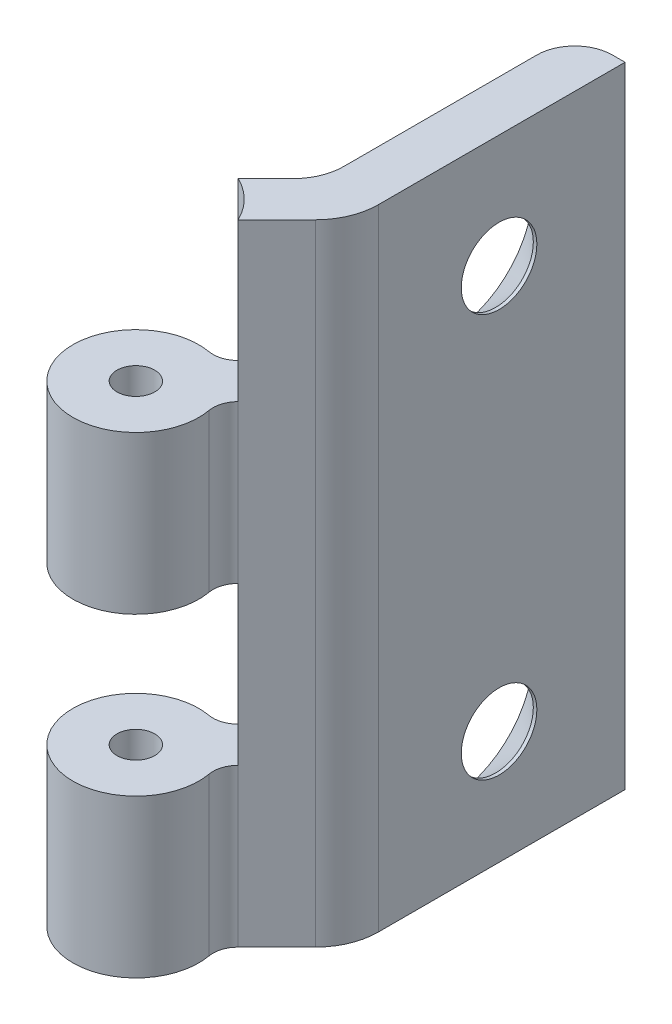
ISO-10303-21;
HEADER;
FILE_DESCRIPTION(('STEP AP214'),'2;1');
FILE_NAME('part.step','',(''),(''),'','','');
FILE_SCHEMA(('AUTOMOTIVE_DESIGN { 1 0 10303 214 1 1 1 1 }'));
ENDSEC;
DATA;
#1=APPLICATION_CONTEXT('core data for automotive mechanical design processes');
#2=APPLICATION_PROTOCOL_DEFINITION('international standard','automotive_design',2000,#1);
#3=PRODUCT_CONTEXT('',#1,'mechanical');
#4=PRODUCT('Part','Part','',(#3));
#5=PRODUCT_RELATED_PRODUCT_CATEGORY('part','',(#4));
#6=PRODUCT_DEFINITION_FORMATION('','',#4);
#7=PRODUCT_DEFINITION_CONTEXT('part definition',#1,'design');
#8=PRODUCT_DEFINITION('design','',#6,#7);
#9=PRODUCT_DEFINITION_SHAPE('','',#8);
#10=(LENGTH_UNIT() NAMED_UNIT(*) SI_UNIT(.MILLI.,.METRE.));
#11=(NAMED_UNIT(*) PLANE_ANGLE_UNIT() SI_UNIT($,.RADIAN.));
#12=(NAMED_UNIT(*) SI_UNIT($,.STERADIAN.) SOLID_ANGLE_UNIT());
#13=UNCERTAINTY_MEASURE_WITH_UNIT(LENGTH_MEASURE(1.E-05),#10,'distance_accuracy_value','');
#14=(GEOMETRIC_REPRESENTATION_CONTEXT(3) GLOBAL_UNCERTAINTY_ASSIGNED_CONTEXT((#13)) GLOBAL_UNIT_ASSIGNED_CONTEXT((#10,
#11,#12)) REPRESENTATION_CONTEXT('',''));
#15=CARTESIAN_POINT('',(0.,0.,0.));
#16=DIRECTION('',(0.,0.,1.));
#17=DIRECTION('',(1.,0.,0.));
#18=AXIS2_PLACEMENT_3D('',#15,#16,#17);
#19=CARTESIAN_POINT('',(0.,0.1,0.));
#20=DIRECTION('',(0.,1.,0.));
#21=DIRECTION('',(0.,0.,1.));
#22=AXIS2_PLACEMENT_3D('',#19,#20,#21);
#23=CYLINDRICAL_SURFACE('',#22,0.75);
#24=CARTESIAN_POINT('',(0.,18.75,0.));
#25=DIRECTION('',(0.,1.,0.));
#26=DIRECTION('',(0.,0.,1.));
#27=AXIS2_PLACEMENT_3D('',#24,#25,#26);
#28=CIRCLE('',#27,0.75);
#29=CARTESIAN_POINT('',(0.,18.75,0.75));
#30=VERTEX_POINT('',#29);
#31=EDGE_CURVE('E178',#30,#30,#28,.F.);
#32=ORIENTED_EDGE('',*,*,#31,.F.);
#33=EDGE_LOOP('',(#32));
#34=FACE_BOUND('',#33,.T.);
#35=CARTESIAN_POINT('',(0.,12.5,0.));
#36=DIRECTION('',(0.,1.,0.));
#37=DIRECTION('',(0.,0.,1.));
#38=AXIS2_PLACEMENT_3D('',#35,#36,#37);
#39=CIRCLE('',#38,0.75);
#40=CARTESIAN_POINT('',(0.,12.5,0.75));
#41=VERTEX_POINT('',#40);
#42=EDGE_CURVE('E189',#41,#41,#39,.F.);
#43=ORIENTED_EDGE('',*,*,#42,.T.);
#44=EDGE_LOOP('',(#43));
#45=FACE_BOUND('',#44,.T.);
#46=ADVANCED_FACE('F16',(#34,#45),#23,.F.);
#47=CARTESIAN_POINT('',(0.616796038786,3.125,-3.44522316353));
#48=DIRECTION('',(0.,1.,0.));
#49=DIRECTION('',(0.,0.,1.));
#50=AXIS2_PLACEMENT_3D('',#47,#48,#49);
#51=CYLINDRICAL_SURFACE('',#50,1.);
#52=CARTESIAN_POINT('',(0.616796038786,12.5,-3.44522316353));
#53=DIRECTION('',(0.,1.,0.));
#54=DIRECTION('',(0.,0.,1.));
#55=AXIS2_PLACEMENT_3D('',#52,#53,#54);
#56=CIRCLE('',#55,1.);
#57=CARTESIAN_POINT('',(1.32390281997229,12.5,-2.73811638234775));
#58=VERTEX_POINT('',#57);
#59=CARTESIAN_POINT('',(0.440568599132631,12.5,-2.4608736882362));
#60=VERTEX_POINT('',#59);
#61=EDGE_CURVE('E19',#58,#60,#56,.F.);
#62=ORIENTED_EDGE('',*,*,#61,.T.);
#63=DIRECTION('',(0.,1.,0.));
#64=VECTOR('',#63,1.);
#65=CARTESIAN_POINT('',(0.440568599132508,3.125,-2.46087368823725));
#66=LINE('',#65,#64);
#67=CARTESIAN_POINT('',(0.440568599132811,18.75,-2.4608736882372));
#68=VERTEX_POINT('',#67);
#69=EDGE_CURVE('E148',#68,#60,#66,.F.);
#70=ORIENTED_EDGE('',*,*,#69,.F.);
#71=CARTESIAN_POINT('',(0.616796038786,18.75,-3.44522316353));
#72=DIRECTION('',(0.,1.,0.));
#73=DIRECTION('',(0.,0.,1.));
#74=AXIS2_PLACEMENT_3D('',#71,#72,#73);
#75=CIRCLE('',#74,1.);
#76=CARTESIAN_POINT('',(1.32390281997229,18.75,-2.73811638234775));
#77=VERTEX_POINT('',#76);
#78=EDGE_CURVE('E131',#77,#68,#75,.F.);
#79=ORIENTED_EDGE('',*,*,#78,.F.);
#80=DIRECTION('',(0.,1.,0.));
#81=VECTOR('',#80,1.);
#82=CARTESIAN_POINT('',(1.32390281997,0.,-2.73811638235));
#83=LINE('',#82,#81);
#84=EDGE_CURVE('E126',#77,#58,#83,.F.);
#85=ORIENTED_EDGE('',*,*,#84,.T.);
#86=EDGE_LOOP('',(#62,#70,#79,#85));
#87=FACE_BOUND('',#86,.T.);
#88=ADVANCED_FACE('F128',(#87),#51,.F.);
#89=CARTESIAN_POINT('',(0.,3.125,0.));
#90=DIRECTION('',(0.,1.,0.));
#91=DIRECTION('',(0.,0.,1.));
#92=AXIS2_PLACEMENT_3D('',#89,#90,#91);
#93=CYLINDRICAL_SURFACE('',#92,2.5);
#94=DIRECTION('',(0.,1.,0.));
#95=VECTOR('',#94,1.);
#96=CARTESIAN_POINT('',(2.46087368823525,3.125,-0.44056859913215));
#97=LINE('',#96,#95);
#98=CARTESIAN_POINT('',(2.4608736882362,12.5,-0.440568599132631));
#99=VERTEX_POINT('',#98);
#100=CARTESIAN_POINT('',(2.4608736882362,18.75,-0.440568599132631));
#101=VERTEX_POINT('',#100);
#102=EDGE_CURVE('E165',#99,#101,#97,.T.);
#103=ORIENTED_EDGE('',*,*,#102,.T.);
#104=CARTESIAN_POINT('',(0.,18.75,0.));
#105=DIRECTION('',(0.,1.,0.));
#106=DIRECTION('',(0.,0.,1.));
#107=AXIS2_PLACEMENT_3D('',#104,#105,#106);
#108=CIRCLE('',#107,2.5);
#109=EDGE_CURVE('E181',#68,#101,#108,.T.);
#110=ORIENTED_EDGE('',*,*,#109,.F.);
#111=ORIENTED_EDGE('',*,*,#69,.T.);
#112=CARTESIAN_POINT('',(0.,12.5,0.));
#113=DIRECTION('',(0.,1.,0.));
#114=DIRECTION('',(0.,0.,1.));
#115=AXIS2_PLACEMENT_3D('',#112,#113,#114);
#116=CIRCLE('',#115,2.5);
#117=EDGE_CURVE('E147',#60,#99,#116,.T.);
#118=ORIENTED_EDGE('',*,*,#117,.T.);
#119=EDGE_LOOP('',(#103,#110,#111,#118));
#120=FACE_BOUND('',#119,.T.);
#121=ADVANCED_FACE('F192',(#120),#93,.T.);
#122=CARTESIAN_POINT('',(0.,12.5,0.));
#123=DIRECTION('',(0.,1.,0.));
#124=DIRECTION('',(0.,0.,1.));
#125=AXIS2_PLACEMENT_3D('',#122,#123,#124);
#126=PLANE('',#125);
#127=ORIENTED_EDGE('',*,*,#42,.F.);
#128=EDGE_LOOP('',(#127));
#129=FACE_BOUND('',#128,.T.);
#130=CARTESIAN_POINT('',(3.44522316353,12.5,-0.616796038786));
#131=DIRECTION('',(0.,1.,0.));
#132=DIRECTION('',(0.,0.,1.));
#133=AXIS2_PLACEMENT_3D('',#130,#131,#132);
#134=CIRCLE('',#133,1.);
#135=CARTESIAN_POINT('',(2.73811638234775,12.5,-1.32390281997229));
#136=VERTEX_POINT('',#135);
#137=EDGE_CURVE('E170',#136,#99,#134,.T.);
#138=ORIENTED_EDGE('',*,*,#137,.T.);
#139=ORIENTED_EDGE('',*,*,#117,.F.);
#140=ORIENTED_EDGE('',*,*,#61,.F.);
#141=CARTESIAN_POINT('',(0.,12.5,0.));
#142=DIRECTION('',(0.,1.,0.));
#143=DIRECTION('',(0.,0.,1.));
#144=AXIS2_PLACEMENT_3D('',#141,#142,#143);
#145=CIRCLE('',#144,3.04138126515);
#146=EDGE_CURVE('E145',#58,#136,#145,.F.);
#147=ORIENTED_EDGE('',*,*,#146,.T.);
#148=EDGE_LOOP('',(#138,#139,#140,#147));
#149=FACE_BOUND('',#148,.T.);
#150=ADVANCED_FACE('F143',(#129,#149),#126,.F.);
#151=CARTESIAN_POINT('',(0.616796038786,3.125,-3.44522316353));
#152=DIRECTION('',(0.,1.,0.));
#153=DIRECTION('',(0.,0.,1.));
#154=AXIS2_PLACEMENT_3D('',#151,#152,#153);
#155=CYLINDRICAL_SURFACE('',#154,1.);
#156=CARTESIAN_POINT('',(0.616796038786,0.,-3.44522316353));
#157=DIRECTION('',(0.,1.,0.));
#158=DIRECTION('',(0.,0.,1.));
#159=AXIS2_PLACEMENT_3D('',#156,#157,#158);
#160=CIRCLE('',#159,1.);
#161=CARTESIAN_POINT('',(0.440568599132631,0.,-2.4608736882362));
#162=VERTEX_POINT('',#161);
#163=CARTESIAN_POINT('',(1.323902819969,0.,-2.738116382349));
#164=VERTEX_POINT('',#163);
#165=EDGE_CURVE('E187',#162,#164,#160,.T.);
#166=ORIENTED_EDGE('',*,*,#165,.F.);
#167=DIRECTION('',(0.,1.,0.));
#168=VECTOR('',#167,1.);
#169=CARTESIAN_POINT('',(0.440568599132508,3.125,-2.46087368823725));
#170=LINE('',#169,#168);
#171=CARTESIAN_POINT('',(0.440568599132631,6.25,-2.4608736882362));
#172=VERTEX_POINT('',#171);
#173=EDGE_CURVE('E226',#172,#162,#170,.F.);
#174=ORIENTED_EDGE('',*,*,#173,.F.);
#175=CARTESIAN_POINT('',(0.616796038786,6.25,-3.44522316353));
#176=DIRECTION('',(0.,1.,0.));
#177=DIRECTION('',(0.,0.,1.));
#178=AXIS2_PLACEMENT_3D('',#175,#176,#177);
#179=CIRCLE('',#178,1.);
#180=CARTESIAN_POINT('',(1.32390281997229,6.25,-2.73811638234775));
#181=VERTEX_POINT('',#180);
#182=EDGE_CURVE('E184',#181,#172,#179,.F.);
#183=ORIENTED_EDGE('',*,*,#182,.F.);
#184=DIRECTION('',(0.,1.,0.));
#185=VECTOR('',#184,1.);
#186=CARTESIAN_POINT('',(1.32390281997,0.,-2.73811638235));
#187=LINE('',#186,#185);
#188=EDGE_CURVE('E137',#181,#164,#187,.F.);
#189=ORIENTED_EDGE('',*,*,#188,.T.);
#190=EDGE_LOOP('',(#166,#174,#183,#189));
#191=FACE_BOUND('',#190,.T.);
#192=ADVANCED_FACE('F545',(#191),#155,.F.);
#193=CARTESIAN_POINT('',(0.,6.25,0.));
#194=DIRECTION('',(0.,1.,0.));
#195=DIRECTION('',(0.,0.,1.));
#196=AXIS2_PLACEMENT_3D('',#193,#194,#195);
#197=PLANE('',#196);
#198=CARTESIAN_POINT('',(0.,6.25,0.));
#199=DIRECTION('',(0.,1.,0.));
#200=DIRECTION('',(0.,0.,1.));
#201=AXIS2_PLACEMENT_3D('',#198,#199,#200);
#202=CIRCLE('',#201,0.75);
#203=CARTESIAN_POINT('',(0.,6.25,0.75));
#204=VERTEX_POINT('',#203);
#205=EDGE_CURVE('E211',#204,#204,#202,.F.);
#206=ORIENTED_EDGE('',*,*,#205,.T.);
#207=EDGE_LOOP('',(#206));
#208=FACE_BOUND('',#207,.T.);
#209=CARTESIAN_POINT('',(3.44522316353,6.25,-0.616796038786));
#210=DIRECTION('',(0.,1.,0.));
#211=DIRECTION('',(0.,0.,1.));
#212=AXIS2_PLACEMENT_3D('',#209,#210,#211);
#213=CIRCLE('',#212,1.);
#214=CARTESIAN_POINT('',(2.4608736882362,6.25,-0.440568599132631));
#215=VERTEX_POINT('',#214);
#216=CARTESIAN_POINT('',(2.73811638234775,6.25,-1.32390281997229));
#217=VERTEX_POINT('',#216);
#218=EDGE_CURVE('E157',#215,#217,#213,.F.);
#219=ORIENTED_EDGE('',*,*,#218,.T.);
#220=CARTESIAN_POINT('',(0.,6.25,0.));
#221=DIRECTION('',(0.,1.,0.));
#222=DIRECTION('',(0.,0.,1.));
#223=AXIS2_PLACEMENT_3D('',#220,#221,#222);
#224=CIRCLE('',#223,3.04138126515);
#225=EDGE_CURVE('E158',#217,#181,#224,.T.);
#226=ORIENTED_EDGE('',*,*,#225,.T.);
#227=ORIENTED_EDGE('',*,*,#182,.T.);
#228=CARTESIAN_POINT('',(0.,6.25,0.));
#229=DIRECTION('',(0.,1.,0.));
#230=DIRECTION('',(0.,0.,1.));
#231=AXIS2_PLACEMENT_3D('',#228,#229,#230);
#232=CIRCLE('',#231,2.5);
#233=EDGE_CURVE('E215',#215,#172,#232,.F.);
#234=ORIENTED_EDGE('',*,*,#233,.F.);
#235=EDGE_LOOP('',(#219,#226,#227,#234));
#236=FACE_BOUND('',#235,.T.);
#237=ADVANCED_FACE('F233',(#208,#236),#197,.T.);
#238=CARTESIAN_POINT('',(0.,18.75,0.));
#239=DIRECTION('',(0.,1.,0.));
#240=DIRECTION('',(0.,0.,1.));
#241=AXIS2_PLACEMENT_3D('',#238,#239,#240);
#242=PLANE('',#241);
#243=ORIENTED_EDGE('',*,*,#31,.T.);
#244=EDGE_LOOP('',(#243));
#245=FACE_BOUND('',#244,.T.);
#246=CARTESIAN_POINT('',(3.44522316353,18.75,-0.616796038786));
#247=DIRECTION('',(0.,1.,0.));
#248=DIRECTION('',(0.,0.,1.));
#249=AXIS2_PLACEMENT_3D('',#246,#247,#248);
#250=CIRCLE('',#249,1.);
#251=CARTESIAN_POINT('',(2.73811638234775,18.75,-1.32390281997229));
#252=VERTEX_POINT('',#251);
#253=EDGE_CURVE('E175',#101,#252,#250,.F.);
#254=ORIENTED_EDGE('',*,*,#253,.T.);
#255=CARTESIAN_POINT('',(0.,18.75,0.));
#256=DIRECTION('',(0.,1.,0.));
#257=DIRECTION('',(0.,0.,1.));
#258=AXIS2_PLACEMENT_3D('',#255,#256,#257);
#259=CIRCLE('',#258,3.04138126515);
#260=EDGE_CURVE('E204',#252,#77,#259,.T.);
#261=ORIENTED_EDGE('',*,*,#260,.T.);
#262=ORIENTED_EDGE('',*,*,#78,.T.);
#263=ORIENTED_EDGE('',*,*,#109,.T.);
#264=EDGE_LOOP('',(#254,#261,#262,#263));
#265=FACE_BOUND('',#264,.T.);
#266=ADVANCED_FACE('F203',(#245,#265),#242,.T.);
#267=CARTESIAN_POINT('',(1.32390281997,0.,-2.73811638235));
#268=DIRECTION('',(0.707106781186548,0.,0.707106781186548));
#269=DIRECTION('',(0.707106781186548,0.,-0.707106781186548));
#270=AXIS2_PLACEMENT_3D('',#267,#268,#269);
#271=PLANE('',#270);
#272=DIRECTION('',(0.707106781186548,0.,-0.707106781186548));
#273=VECTOR('',#272,1.);
#274=CARTESIAN_POINT('',(1.32390281997,0.,-2.73811638235));
#275=LINE('',#274,#273);
#276=CARTESIAN_POINT('',(2.40473484440701,0.,-3.81894840678699));
#277=VERTEX_POINT('',#276);
#278=EDGE_CURVE('E177',#164,#277,#275,.T.);
#279=ORIENTED_EDGE('',*,*,#278,.F.);
#280=ORIENTED_EDGE('',*,*,#188,.F.);
#281=DIRECTION('',(0.,1.,0.));
#282=VECTOR('',#281,1.);
#283=CARTESIAN_POINT('',(1.3239028199691,9.375,-2.73811638234814));
#284=LINE('',#283,#282);
#285=EDGE_CURVE('E151',#181,#58,#284,.T.);
#286=ORIENTED_EDGE('',*,*,#285,.T.);
#287=ORIENTED_EDGE('',*,*,#84,.F.);
#288=DIRECTION('',(0.,1.,0.));
#289=VECTOR('',#288,1.);
#290=CARTESIAN_POINT('',(1.3239028199691,9.375,-2.73811638234814));
#291=LINE('',#290,#289);
#292=CARTESIAN_POINT('',(1.32390281996878,25.,-2.7381163823483));
#293=VERTEX_POINT('',#292);
#294=EDGE_CURVE('E210',#77,#293,#291,.T.);
#295=ORIENTED_EDGE('',*,*,#294,.T.);
#296=DIRECTION('',(0.707106781186548,0.,-0.707106781186548));
#297=VECTOR('',#296,1.);
#298=CARTESIAN_POINT('',(1.32390281997,25.,-2.73811638235));
#299=LINE('',#298,#297);
#300=CARTESIAN_POINT('',(2.40473484440701,25.,-3.81894840678699));
#301=VERTEX_POINT('',#300);
#302=EDGE_CURVE('E138',#301,#293,#299,.F.);
#303=ORIENTED_EDGE('',*,*,#302,.F.);
#304=DIRECTION('',(0.,1.,0.));
#305=VECTOR('',#304,1.);
#306=CARTESIAN_POINT('',(2.40473484440503,3.125,-3.81894840678497));
#307=LINE('',#306,#305);
#308=EDGE_CURVE('E227',#301,#277,#307,.F.);
#309=ORIENTED_EDGE('',*,*,#308,.T.);
#310=EDGE_LOOP('',(#279,#280,#286,#287,#295,#303,#309));
#311=FACE_BOUND('',#310,.T.);
#312=ADVANCED_FACE('F153',(#311),#271,.F.);
#313=CARTESIAN_POINT('',(3.44522316353,3.125,-0.616796038786));
#314=DIRECTION('',(0.,1.,0.));
#315=DIRECTION('',(0.,0.,1.));
#316=AXIS2_PLACEMENT_3D('',#313,#314,#315);
#317=CYLINDRICAL_SURFACE('',#316,1.);
#318=ORIENTED_EDGE('',*,*,#137,.F.);
#319=DIRECTION('',(0.,1.,0.));
#320=VECTOR('',#319,1.);
#321=CARTESIAN_POINT('',(2.73811638235,0.,-1.32390281997));
#322=LINE('',#321,#320);
#323=EDGE_CURVE('E199',#252,#136,#322,.F.);
#324=ORIENTED_EDGE('',*,*,#323,.F.);
#325=ORIENTED_EDGE('',*,*,#253,.F.);
#326=ORIENTED_EDGE('',*,*,#102,.F.);
#327=EDGE_LOOP('',(#318,#324,#325,#326));
#328=FACE_BOUND('',#327,.T.);
#329=ADVANCED_FACE('F198',(#328),#317,.F.);
#330=CARTESIAN_POINT('',(0.,9.375,0.));
#331=DIRECTION('',(0.,1.,0.));
#332=DIRECTION('',(0.,0.,1.));
#333=AXIS2_PLACEMENT_3D('',#330,#331,#332);
#334=CYLINDRICAL_SURFACE('',#333,3.04138126515);
#335=ORIENTED_EDGE('',*,*,#225,.F.);
#336=DIRECTION('',(0.,1.,0.));
#337=VECTOR('',#336,1.);
#338=CARTESIAN_POINT('',(2.73811638235,0.,-1.32390281997));
#339=LINE('',#338,#337);
#340=EDGE_CURVE('E163',#136,#217,#339,.F.);
#341=ORIENTED_EDGE('',*,*,#340,.F.);
#342=ORIENTED_EDGE('',*,*,#146,.F.);
#343=ORIENTED_EDGE('',*,*,#285,.F.);
#344=EDGE_LOOP('',(#335,#341,#342,#343));
#345=FACE_BOUND('',#344,.T.);
#346=ADVANCED_FACE('F161',(#345),#334,.F.);
#347=CARTESIAN_POINT('',(3.44522316353,3.125,-0.616796038786));
#348=DIRECTION('',(0.,1.,0.));
#349=DIRECTION('',(0.,0.,1.));
#350=AXIS2_PLACEMENT_3D('',#347,#348,#349);
#351=CYLINDRICAL_SURFACE('',#350,1.);
#352=CARTESIAN_POINT('',(3.44522316353,0.,-0.616796038786));
#353=DIRECTION('',(0.,1.,0.));
#354=DIRECTION('',(0.,0.,1.));
#355=AXIS2_PLACEMENT_3D('',#352,#353,#354);
#356=CIRCLE('',#355,1.);
#357=CARTESIAN_POINT('',(2.738116382349,0.,-1.323902819969));
#358=VERTEX_POINT('',#357);
#359=CARTESIAN_POINT('',(2.4608736882362,0.,-0.440568599132631));
#360=VERTEX_POINT('',#359);
#361=EDGE_CURVE('E230',#358,#360,#356,.T.);
#362=ORIENTED_EDGE('',*,*,#361,.F.);
#363=DIRECTION('',(0.,1.,0.));
#364=VECTOR('',#363,1.);
#365=CARTESIAN_POINT('',(2.73811638235,0.,-1.32390281997));
#366=LINE('',#365,#364);
#367=EDGE_CURVE('E239',#217,#358,#366,.F.);
#368=ORIENTED_EDGE('',*,*,#367,.F.);
#369=ORIENTED_EDGE('',*,*,#218,.F.);
#370=DIRECTION('',(0.,1.,0.));
#371=VECTOR('',#370,1.);
#372=CARTESIAN_POINT('',(2.46087368823725,3.125,-0.440568599132508));
#373=LINE('',#372,#371);
#374=EDGE_CURVE('E223',#360,#215,#373,.T.);
#375=ORIENTED_EDGE('',*,*,#374,.F.);
#376=EDGE_LOOP('',(#362,#368,#369,#375));
#377=FACE_BOUND('',#376,.T.);
#378=ADVANCED_FACE('F240',(#377),#351,.F.);
#379=CARTESIAN_POINT('',(0.967637632578,3.125,-5.25604561862));
#380=DIRECTION('',(0.,1.,0.));
#381=DIRECTION('',(0.,0.,1.));
#382=AXIS2_PLACEMENT_3D('',#379,#380,#381);
#383=CYLINDRICAL_SURFACE('',#382,2.03236236742);
#384=CARTESIAN_POINT('',(0.967637632578,0.,-5.25604561862));
#385=DIRECTION('',(0.,1.,0.));
#386=DIRECTION('',(0.,0.,1.));
#387=AXIS2_PLACEMENT_3D('',#384,#385,#386);
#388=CIRCLE('',#387,2.03236236742);
#389=CARTESIAN_POINT('',(3.,0.,-5.25604561862));
#390=VERTEX_POINT('',#389);
#391=EDGE_CURVE('E224',#277,#390,#388,.T.);
#392=ORIENTED_EDGE('',*,*,#391,.F.);
#393=ORIENTED_EDGE('',*,*,#308,.F.);
#394=CARTESIAN_POINT('',(0.967637632578,25.,-5.25604561862));
#395=DIRECTION('',(0.,1.,0.));
#396=DIRECTION('',(0.,0.,1.));
#397=AXIS2_PLACEMENT_3D('',#394,#395,#396);
#398=CIRCLE('',#397,2.03236236742);
#399=CARTESIAN_POINT('',(3.,25.,-5.25604561862));
#400=VERTEX_POINT('',#399);
#401=EDGE_CURVE('E228',#400,#301,#398,.F.);
#402=ORIENTED_EDGE('',*,*,#401,.F.);
#403=DIRECTION('',(0.,1.,0.));
#404=VECTOR('',#403,1.);
#405=CARTESIAN_POINT('',(3.,0.,-5.25604561862));
#406=LINE('',#405,#404);
#407=EDGE_CURVE('E243',#400,#390,#406,.F.);
#408=ORIENTED_EDGE('',*,*,#407,.T.);
#409=EDGE_LOOP('',(#392,#393,#402,#408));
#410=FACE_BOUND('',#409,.T.);
#411=ADVANCED_FACE('F493',(#410),#383,.F.);
#412=CARTESIAN_POINT('',(0.,3.125,0.));
#413=DIRECTION('',(0.,1.,0.));
#414=DIRECTION('',(0.,0.,1.));
#415=AXIS2_PLACEMENT_3D('',#412,#413,#414);
#416=CYLINDRICAL_SURFACE('',#415,2.5);
#417=ORIENTED_EDGE('',*,*,#374,.T.);
#418=ORIENTED_EDGE('',*,*,#233,.T.);
#419=ORIENTED_EDGE('',*,*,#173,.T.);
#420=CARTESIAN_POINT('',(0.,0.,0.));
#421=DIRECTION('',(0.,1.,0.));
#422=DIRECTION('',(0.,0.,1.));
#423=AXIS2_PLACEMENT_3D('',#420,#421,#422);
#424=CIRCLE('',#423,2.5);
#425=EDGE_CURVE('E282',#162,#360,#424,.T.);
#426=ORIENTED_EDGE('',*,*,#425,.T.);
#427=EDGE_LOOP('',(#417,#418,#419,#426));
#428=FACE_BOUND('',#427,.T.);
#429=ADVANCED_FACE('F310',(#428),#416,.T.);
#430=CARTESIAN_POINT('',(0.,0.1,0.));
#431=DIRECTION('',(0.,1.,0.));
#432=DIRECTION('',(0.,0.,1.));
#433=AXIS2_PLACEMENT_3D('',#430,#431,#432);
#434=CYLINDRICAL_SURFACE('',#433,0.75);
#435=CARTESIAN_POINT('',(0.,0.,0.));
#436=DIRECTION('',(0.,1.,0.));
#437=DIRECTION('',(0.,0.,1.));
#438=AXIS2_PLACEMENT_3D('',#435,#436,#437);
#439=CIRCLE('',#438,0.75);
#440=CARTESIAN_POINT('',(0.,0.,0.75));
#441=VERTEX_POINT('',#440);
#442=EDGE_CURVE('E272',#441,#441,#439,.F.);
#443=ORIENTED_EDGE('',*,*,#442,.T.);
#444=EDGE_LOOP('',(#443));
#445=FACE_BOUND('',#444,.T.);
#446=ORIENTED_EDGE('',*,*,#205,.F.);
#447=EDGE_LOOP('',(#446));
#448=FACE_BOUND('',#447,.T.);
#449=ADVANCED_FACE('F477',(#445,#448),#434,.F.);
#450=CARTESIAN_POINT('',(0.,9.375,0.));
#451=DIRECTION('',(0.,1.,0.));
#452=DIRECTION('',(0.,0.,1.));
#453=AXIS2_PLACEMENT_3D('',#450,#451,#452);
#454=CYLINDRICAL_SURFACE('',#453,3.04138126515);
#455=ORIENTED_EDGE('',*,*,#260,.F.);
#456=DIRECTION('',(0.,1.,0.));
#457=VECTOR('',#456,1.);
#458=CARTESIAN_POINT('',(2.73811638235,0.,-1.32390281997));
#459=LINE('',#458,#457);
#460=CARTESIAN_POINT('',(2.73811638234923,25.,-1.32390281996923));
#461=VERTEX_POINT('',#460);
#462=EDGE_CURVE('E208',#461,#252,#459,.F.);
#463=ORIENTED_EDGE('',*,*,#462,.F.);
#464=CARTESIAN_POINT('',(0.,25.,0.));
#465=DIRECTION('',(0.,1.,0.));
#466=DIRECTION('',(0.,0.,1.));
#467=AXIS2_PLACEMENT_3D('',#464,#465,#466);
#468=CIRCLE('',#467,3.04138126515);
#469=EDGE_CURVE('E268',#293,#461,#468,.F.);
#470=ORIENTED_EDGE('',*,*,#469,.F.);
#471=ORIENTED_EDGE('',*,*,#294,.F.);
#472=EDGE_LOOP('',(#455,#463,#470,#471));
#473=FACE_BOUND('',#472,.T.);
#474=ADVANCED_FACE('F206',(#473),#454,.F.);
#475=CARTESIAN_POINT('',(2.73811638235,0.,-1.32390281997));
#476=DIRECTION('',(0.707106781186548,0.,0.707106781186548));
#477=DIRECTION('',(0.707106781186548,0.,-0.707106781186548));
#478=AXIS2_PLACEMENT_3D('',#475,#476,#477);
#479=PLANE('',#478);
#480=DIRECTION('',(0.,1.,0.));
#481=VECTOR('',#480,1.);
#482=CARTESIAN_POINT('',(4.26776695296637,3.125,-2.85355339059363));
#483=LINE('',#482,#481);
#484=CARTESIAN_POINT('',(4.26776695296818,25.,-2.85355339059182));
#485=VERTEX_POINT('',#484);
#486=CARTESIAN_POINT('',(4.26776695296818,0.,-2.85355339059182));
#487=VERTEX_POINT('',#486);
#488=EDGE_CURVE('E284',#485,#487,#483,.F.);
#489=ORIENTED_EDGE('',*,*,#488,.F.);
#490=DIRECTION('',(0.707106781186548,0.,-0.707106781186547));
#491=VECTOR('',#490,1.);
#492=CARTESIAN_POINT('',(2.73811638235,25.,-1.32390281997));
#493=LINE('',#492,#491);
#494=EDGE_CURVE('E267',#461,#485,#493,.T.);
#495=ORIENTED_EDGE('',*,*,#494,.F.);
#496=ORIENTED_EDGE('',*,*,#462,.T.);
#497=ORIENTED_EDGE('',*,*,#323,.T.);
#498=ORIENTED_EDGE('',*,*,#340,.T.);
#499=ORIENTED_EDGE('',*,*,#367,.T.);
#500=DIRECTION('',(0.707106781186548,0.,-0.707106781186547));
#501=VECTOR('',#500,1.);
#502=CARTESIAN_POINT('',(2.73811638235,0.,-1.32390281997));
#503=LINE('',#502,#501);
#504=EDGE_CURVE('E281',#358,#487,#503,.T.);
#505=ORIENTED_EDGE('',*,*,#504,.T.);
#506=EDGE_LOOP('',(#489,#495,#496,#497,#498,#499,#505));
#507=FACE_BOUND('',#506,.T.);
#508=ADVANCED_FACE('F245',(#507),#479,.T.);
#509=CARTESIAN_POINT('',(4.5,3.125,-12.9142135624));
#510=DIRECTION('',(0.,1.,0.));
#511=DIRECTION('',(0.,0.,1.));
#512=AXIS2_PLACEMENT_3D('',#509,#510,#511);
#513=CYLINDRICAL_SURFACE('',#512,1.5);
#514=DIRECTION('',(0.,1.,0.));
#515=VECTOR('',#514,1.);
#516=CARTESIAN_POINT('',(3.,0.,-12.9142135624));
#517=LINE('',#516,#515);
#518=CARTESIAN_POINT('',(3.,0.,-12.9142135624));
#519=VERTEX_POINT('',#518);
#520=CARTESIAN_POINT('',(3.,25.,-12.9142135624));
#521=VERTEX_POINT('',#520);
#522=EDGE_CURVE('E292',#519,#521,#517,.T.);
#523=ORIENTED_EDGE('',*,*,#522,.T.);
#524=CARTESIAN_POINT('',(4.5,25.,-12.9142135624));
#525=DIRECTION('',(0.,1.,0.));
#526=DIRECTION('',(0.,0.,1.));
#527=AXIS2_PLACEMENT_3D('',#524,#525,#526);
#528=CIRCLE('',#527,1.5);
#529=CARTESIAN_POINT('',(4.5,25.,-14.4142135624));
#530=VERTEX_POINT('',#529);
#531=EDGE_CURVE('E260',#530,#521,#528,.T.);
#532=ORIENTED_EDGE('',*,*,#531,.F.);
#533=DIRECTION('',(0.,1.,0.));
#534=VECTOR('',#533,1.);
#535=CARTESIAN_POINT('',(4.5,0.,-14.4142135624));
#536=LINE('',#535,#534);
#537=CARTESIAN_POINT('',(4.5,0.,-14.4142135624));
#538=VERTEX_POINT('',#537);
#539=EDGE_CURVE('E275',#530,#538,#536,.F.);
#540=ORIENTED_EDGE('',*,*,#539,.T.);
#541=CARTESIAN_POINT('',(4.5,0.,-12.9142135624));
#542=DIRECTION('',(0.,1.,0.));
#543=DIRECTION('',(0.,0.,1.));
#544=AXIS2_PLACEMENT_3D('',#541,#542,#543);
#545=CIRCLE('',#544,1.5);
#546=EDGE_CURVE('E277',#538,#519,#545,.T.);
#547=ORIENTED_EDGE('',*,*,#546,.T.);
#548=EDGE_LOOP('',(#523,#532,#540,#547));
#549=FACE_BOUND('',#548,.T.);
#550=ADVANCED_FACE('F455',(#549),#513,.T.);
#551=CARTESIAN_POINT('',(3.,0.,-5.25604561862));
#552=DIRECTION('',(1.,0.,0.));
#553=DIRECTION('',(0.,0.,-1.));
#554=AXIS2_PLACEMENT_3D('',#551,#552,#553);
#555=PLANE('',#554);
#556=CARTESIAN_POINT('',(3.00000000004275,4.5,-9.41421356237));
#557=DIRECTION('',(-1.,0.,0.));
#558=DIRECTION('',(0.,0.,1.));
#559=AXIS2_PLACEMENT_3D('',#556,#557,#558);
#560=CIRCLE('',#559,3.36000000002591);
#561=CARTESIAN_POINT('',(3.00000000004275,4.5,-6.05421356234409));
#562=VERTEX_POINT('',#561);
#563=EDGE_CURVE('E285',#562,#562,#560,.F.);
#564=ORIENTED_EDGE('',*,*,#563,.T.);
#565=EDGE_LOOP('',(#564));
#566=FACE_BOUND('',#565,.T.);
#567=CARTESIAN_POINT('',(3.00000000002941,20.5,-9.41421356237));
#568=DIRECTION('',(-1.,0.,0.));
#569=DIRECTION('',(0.,0.,1.));
#570=AXIS2_PLACEMENT_3D('',#567,#568,#569);
#571=CIRCLE('',#570,3.36000000011183);
#572=CARTESIAN_POINT('',(3.00000000002941,20.5,-6.05421356225817));
#573=VERTEX_POINT('',#572);
#574=EDGE_CURVE('E218',#573,#573,#571,.F.);
#575=ORIENTED_EDGE('',*,*,#574,.T.);
#576=EDGE_LOOP('',(#575));
#577=FACE_BOUND('',#576,.T.);
#578=DIRECTION('',(0.,0.,1.));
#579=VECTOR('',#578,1.);
#580=CARTESIAN_POINT('',(3.,0.,0.));
#581=LINE('',#580,#579);
#582=EDGE_CURVE('E276',#519,#390,#581,.T.);
#583=ORIENTED_EDGE('',*,*,#582,.T.);
#584=ORIENTED_EDGE('',*,*,#407,.F.);
#585=DIRECTION('',(0.,0.,1.));
#586=VECTOR('',#585,1.);
#587=CARTESIAN_POINT('',(3.,25.,0.));
#588=LINE('',#587,#586);
#589=EDGE_CURVE('E263',#521,#400,#588,.T.);
#590=ORIENTED_EDGE('',*,*,#589,.F.);
#591=ORIENTED_EDGE('',*,*,#522,.F.);
#592=EDGE_LOOP('',(#583,#584,#590,#591));
#593=FACE_BOUND('',#592,.T.);
#594=ADVANCED_FACE('F447',(#566,#577,#593),#555,.F.);
#595=CARTESIAN_POINT('',(3.00000000015643,20.5,-9.41421356237));
#596=DIRECTION('',(-1.,0.,0.));
#597=DIRECTION('',(0.,0.,1.));
#598=AXIS2_PLACEMENT_3D('',#595,#596,#597);
#599=CONICAL_SURFACE('',#598,3.35999999998481,0.785398163400972);
#600=CARTESIAN_POINT('',(4.86,20.5,-9.41421356237));
#601=DIRECTION('',(1.,0.,0.));
#602=DIRECTION('',(0.,0.,-1.));
#603=AXIS2_PLACEMENT_3D('',#600,#601,#602);
#604=CIRCLE('',#603,1.5);
#605=CARTESIAN_POINT('',(4.86,20.5,-10.91421356237));
#606=VERTEX_POINT('',#605);
#607=EDGE_CURVE('E303',#606,#606,#604,.T.);
#608=ORIENTED_EDGE('',*,*,#607,.T.);
#609=EDGE_LOOP('',(#608));
#610=FACE_BOUND('',#609,.T.);
#611=ORIENTED_EDGE('',*,*,#574,.F.);
#612=EDGE_LOOP('',(#611));
#613=FACE_BOUND('',#612,.T.);
#614=ADVANCED_FACE('F439',(#610,#613),#599,.F.);
#615=CARTESIAN_POINT('',(3.00000000009959,4.5,-9.41421356237));
#616=DIRECTION('',(-1.,0.,0.));
#617=DIRECTION('',(0.,0.,1.));
#618=AXIS2_PLACEMENT_3D('',#615,#616,#617);
#619=CONICAL_SURFACE('',#618,3.35999999996907,0.78539816338577);
#620=CARTESIAN_POINT('',(4.86,4.5,-9.41421356237));
#621=DIRECTION('',(1.,0.,0.));
#622=DIRECTION('',(0.,0.,-1.));
#623=AXIS2_PLACEMENT_3D('',#620,#621,#622);
#624=CIRCLE('',#623,1.5);
#625=CARTESIAN_POINT('',(4.86,4.5,-10.91421356237));
#626=VERTEX_POINT('',#625);
#627=EDGE_CURVE('E318',#626,#626,#624,.T.);
#628=ORIENTED_EDGE('',*,*,#627,.T.);
#629=EDGE_LOOP('',(#628));
#630=FACE_BOUND('',#629,.T.);
#631=ORIENTED_EDGE('',*,*,#563,.F.);
#632=EDGE_LOOP('',(#631));
#633=FACE_BOUND('',#632,.T.);
#634=ADVANCED_FACE('F430',(#630,#633),#619,.F.);
#635=CARTESIAN_POINT('',(2.5,3.125,-4.62132034356));
#636=DIRECTION('',(0.,1.,0.));
#637=DIRECTION('',(0.,0.,1.));
#638=AXIS2_PLACEMENT_3D('',#635,#636,#637);
#639=CYLINDRICAL_SURFACE('',#638,2.5);
#640=DIRECTION('',(0.,1.,0.));
#641=VECTOR('',#640,1.);
#642=CARTESIAN_POINT('',(5.,0.,-4.62132034356));
#643=LINE('',#642,#641);
#644=CARTESIAN_POINT('',(5.,25.,-4.62132034356));
#645=VERTEX_POINT('',#644);
#646=CARTESIAN_POINT('',(5.,0.,-4.62132034356));
#647=VERTEX_POINT('',#646);
#648=EDGE_CURVE('E320',#645,#647,#643,.F.);
#649=ORIENTED_EDGE('',*,*,#648,.F.);
#650=CARTESIAN_POINT('',(2.5,25.,-4.62132034356));
#651=DIRECTION('',(0.,1.,0.));
#652=DIRECTION('',(0.,0.,1.));
#653=AXIS2_PLACEMENT_3D('',#650,#651,#652);
#654=CIRCLE('',#653,2.5);
#655=EDGE_CURVE('E264',#485,#645,#654,.T.);
#656=ORIENTED_EDGE('',*,*,#655,.F.);
#657=ORIENTED_EDGE('',*,*,#488,.T.);
#658=CARTESIAN_POINT('',(2.5,0.,-4.62132034356));
#659=DIRECTION('',(0.,1.,0.));
#660=DIRECTION('',(0.,0.,1.));
#661=AXIS2_PLACEMENT_3D('',#658,#659,#660);
#662=CIRCLE('',#661,2.5);
#663=EDGE_CURVE('E279',#487,#647,#662,.T.);
#664=ORIENTED_EDGE('',*,*,#663,.T.);
#665=EDGE_LOOP('',(#649,#656,#657,#664));
#666=FACE_BOUND('',#665,.T.);
#667=ADVANCED_FACE('F368',(#666),#639,.T.);
#668=CARTESIAN_POINT('',(0.,0.,0.));
#669=DIRECTION('',(0.,1.,0.));
#670=DIRECTION('',(0.,0.,1.));
#671=AXIS2_PLACEMENT_3D('',#668,#669,#670);
#672=PLANE('',#671);
#673=ORIENTED_EDGE('',*,*,#442,.F.);
#674=EDGE_LOOP('',(#673));
#675=FACE_BOUND('',#674,.T.);
#676=ORIENTED_EDGE('',*,*,#278,.T.);
#677=ORIENTED_EDGE('',*,*,#391,.T.);
#678=ORIENTED_EDGE('',*,*,#582,.F.);
#679=ORIENTED_EDGE('',*,*,#546,.F.);
#680=DIRECTION('',(1.,0.,0.));
#681=VECTOR('',#680,1.);
#682=CARTESIAN_POINT('',(4.5,0.,-14.4142135624));
#683=LINE('',#682,#681);
#684=CARTESIAN_POINT('',(5.,0.,-14.4142135624));
#685=VERTEX_POINT('',#684);
#686=EDGE_CURVE('E271',#538,#685,#683,.T.);
#687=ORIENTED_EDGE('',*,*,#686,.T.);
#688=DIRECTION('',(0.,0.,-1.));
#689=VECTOR('',#688,1.);
#690=CARTESIAN_POINT('',(5.,0.,-4.62132034356));
#691=LINE('',#690,#689);
#692=EDGE_CURVE('E324',#647,#685,#691,.T.);
#693=ORIENTED_EDGE('',*,*,#692,.F.);
#694=ORIENTED_EDGE('',*,*,#663,.F.);
#695=ORIENTED_EDGE('',*,*,#504,.F.);
#696=ORIENTED_EDGE('',*,*,#361,.T.);
#697=ORIENTED_EDGE('',*,*,#425,.F.);
#698=ORIENTED_EDGE('',*,*,#165,.T.);
#699=EDGE_LOOP('',(#676,#677,#678,#679,#687,#693,#694,#695,#696,#697,#698));
#700=FACE_BOUND('',#699,.T.);
#701=ADVANCED_FACE('F312',(#675,#700),#672,.F.);
#702=CARTESIAN_POINT('',(4.5,0.,-14.4142135624));
#703=DIRECTION('',(0.,0.,1.));
#704=DIRECTION('',(1.,0.,0.));
#705=AXIS2_PLACEMENT_3D('',#702,#703,#704);
#706=PLANE('',#705);
#707=ORIENTED_EDGE('',*,*,#686,.F.);
#708=ORIENTED_EDGE('',*,*,#539,.F.);
#709=DIRECTION('',(1.,0.,0.));
#710=VECTOR('',#709,1.);
#711=CARTESIAN_POINT('',(0.,25.,-14.4142135624));
#712=LINE('',#711,#710);
#713=CARTESIAN_POINT('',(5.,25.,-14.4142135624));
#714=VERTEX_POINT('',#713);
#715=EDGE_CURVE('E34',#714,#530,#712,.F.);
#716=ORIENTED_EDGE('',*,*,#715,.F.);
#717=DIRECTION('',(0.,1.,0.));
#718=VECTOR('',#717,1.);
#719=CARTESIAN_POINT('',(5.,0.,-14.4142135624));
#720=LINE('',#719,#718);
#721=EDGE_CURVE('E340',#685,#714,#720,.T.);
#722=ORIENTED_EDGE('',*,*,#721,.F.);
#723=EDGE_LOOP('',(#707,#708,#716,#722));
#724=FACE_BOUND('',#723,.T.);
#725=ADVANCED_FACE('F357',(#724),#706,.F.);
#726=CARTESIAN_POINT('',(0.,25.,0.));
#727=DIRECTION('',(0.,1.,0.));
#728=DIRECTION('',(0.,0.,1.));
#729=AXIS2_PLACEMENT_3D('',#726,#727,#728);
#730=PLANE('',#729);
#731=ORIENTED_EDGE('',*,*,#589,.T.);
#732=ORIENTED_EDGE('',*,*,#401,.T.);
#733=ORIENTED_EDGE('',*,*,#302,.T.);
#734=ORIENTED_EDGE('',*,*,#469,.T.);
#735=ORIENTED_EDGE('',*,*,#494,.T.);
#736=ORIENTED_EDGE('',*,*,#655,.T.);
#737=DIRECTION('',(0.,0.,-1.));
#738=VECTOR('',#737,1.);
#739=CARTESIAN_POINT('',(5.,25.,-4.62132034356));
#740=LINE('',#739,#738);
#741=EDGE_CURVE('E259',#714,#645,#740,.F.);
#742=ORIENTED_EDGE('',*,*,#741,.F.);
#743=ORIENTED_EDGE('',*,*,#715,.T.);
#744=ORIENTED_EDGE('',*,*,#531,.T.);
#745=EDGE_LOOP('',(#731,#732,#733,#734,#735,#736,#742,#743,#744));
#746=FACE_BOUND('',#745,.T.);
#747=ADVANCED_FACE('F359',(#746),#730,.T.);
#748=CARTESIAN_POINT('',(3.1,20.5,-9.41421356237));
#749=DIRECTION('',(1.,0.,0.));
#750=DIRECTION('',(0.,0.,-1.));
#751=AXIS2_PLACEMENT_3D('',#748,#749,#750);
#752=CYLINDRICAL_SURFACE('',#751,1.5);
#753=ORIENTED_EDGE('',*,*,#607,.F.);
#754=EDGE_LOOP('',(#753));
#755=FACE_BOUND('',#754,.T.);
#756=CARTESIAN_POINT('',(5.,20.5,-9.41421356237));
#757=DIRECTION('',(1.,0.,0.));
#758=DIRECTION('',(0.,0.,-1.));
#759=AXIS2_PLACEMENT_3D('',#756,#757,#758);
#760=CIRCLE('',#759,1.5);
#761=CARTESIAN_POINT('',(5.,20.5,-10.91421356237));
#762=VERTEX_POINT('',#761);
#763=EDGE_CURVE('E25',#762,#762,#760,.F.);
#764=ORIENTED_EDGE('',*,*,#763,.F.);
#765=EDGE_LOOP('',(#764));
#766=FACE_BOUND('',#765,.T.);
#767=ADVANCED_FACE('F366',(#755,#766),#752,.F.);
#768=CARTESIAN_POINT('',(3.1,4.5,-9.41421356237));
#769=DIRECTION('',(1.,0.,0.));
#770=DIRECTION('',(0.,0.,-1.));
#771=AXIS2_PLACEMENT_3D('',#768,#769,#770);
#772=CYLINDRICAL_SURFACE('',#771,1.5);
#773=ORIENTED_EDGE('',*,*,#627,.F.);
#774=EDGE_LOOP('',(#773));
#775=FACE_BOUND('',#774,.T.);
#776=CARTESIAN_POINT('',(5.,4.5,-9.41421356237));
#777=DIRECTION('',(1.,0.,0.));
#778=DIRECTION('',(0.,0.,-1.));
#779=AXIS2_PLACEMENT_3D('',#776,#777,#778);
#780=CIRCLE('',#779,1.5);
#781=CARTESIAN_POINT('',(5.,4.5,-10.91421356237));
#782=VERTEX_POINT('',#781);
#783=EDGE_CURVE('E11',#782,#782,#780,.F.);
#784=ORIENTED_EDGE('',*,*,#783,.F.);
#785=EDGE_LOOP('',(#784));
#786=FACE_BOUND('',#785,.T.);
#787=ADVANCED_FACE('F372',(#775,#786),#772,.F.);
#788=CARTESIAN_POINT('',(5.,0.,-4.62132034356));
#789=DIRECTION('',(1.,0.,0.));
#790=DIRECTION('',(0.,0.,-1.));
#791=AXIS2_PLACEMENT_3D('',#788,#789,#790);
#792=PLANE('',#791);
#793=ORIENTED_EDGE('',*,*,#783,.T.);
#794=EDGE_LOOP('',(#793));
#795=FACE_BOUND('',#794,.T.);
#796=ORIENTED_EDGE('',*,*,#763,.T.);
#797=EDGE_LOOP('',(#796));
#798=FACE_BOUND('',#797,.T.);
#799=ORIENTED_EDGE('',*,*,#721,.T.);
#800=ORIENTED_EDGE('',*,*,#741,.T.);
#801=ORIENTED_EDGE('',*,*,#648,.T.);
#802=ORIENTED_EDGE('',*,*,#692,.T.);
#803=EDGE_LOOP('',(#799,#800,#801,#802));
#804=FACE_BOUND('',#803,.T.);
#805=ADVANCED_FACE('F353',(#795,#798,#804),#792,.T.);
#806=CLOSED_SHELL('',(#46,#88,#121,#150,#192,#237,#266,#312,#329,#346,#378,#411,#429,#449,#474,
#508,#550,#594,#614,#634,#667,#701,#725,#747,#767,#787,#805));
#807=MANIFOLD_SOLID_BREP('B1',#806);
#808=ADVANCED_BREP_SHAPE_REPRESENTATION('',(#18,#807),#14);
#809=SHAPE_DEFINITION_REPRESENTATION(#9,#808);
ENDSEC;
END-ISO-10303-21;
